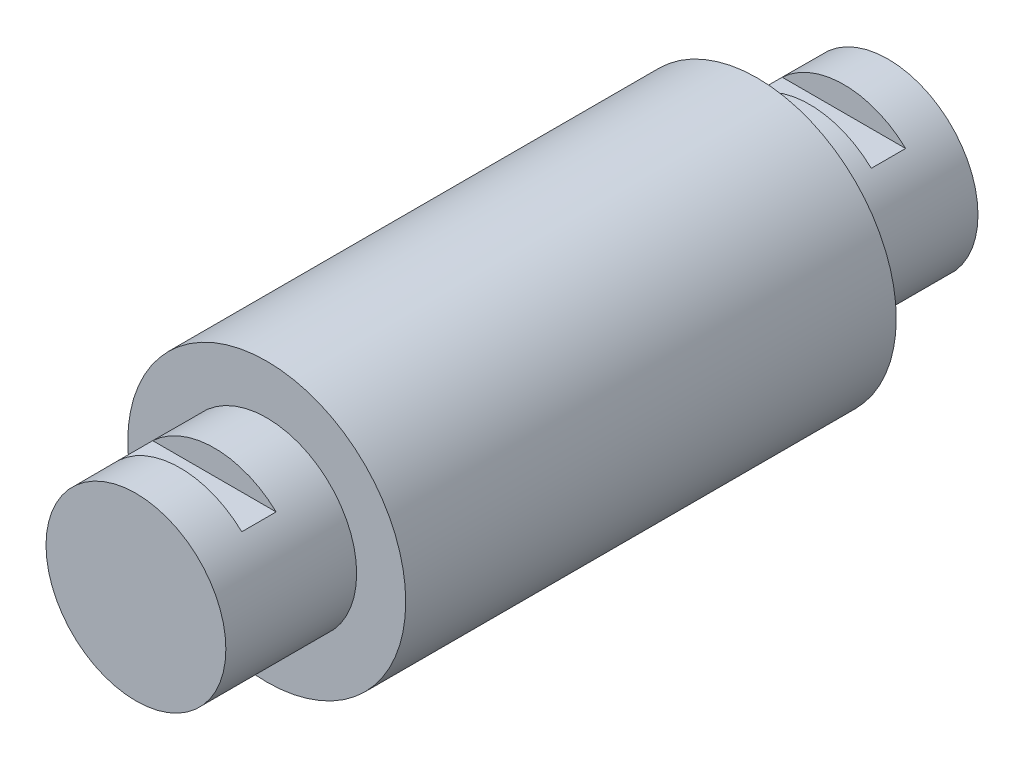
ISO-10303-21;
HEADER;
FILE_DESCRIPTION(('STEP AP214'),'2;1');
FILE_NAME('part.step','',(''),(''),'','','');
FILE_SCHEMA(('AUTOMOTIVE_DESIGN { 1 0 10303 214 1 1 1 1 }'));
ENDSEC;
DATA;
#1=APPLICATION_CONTEXT('core data for automotive mechanical design processes');
#2=APPLICATION_PROTOCOL_DEFINITION('international standard','automotive_design',2000,#1);
#3=PRODUCT_CONTEXT('',#1,'mechanical');
#4=PRODUCT('Part','Part','',(#3));
#5=PRODUCT_RELATED_PRODUCT_CATEGORY('part','',(#4));
#6=PRODUCT_DEFINITION_FORMATION('','',#4);
#7=PRODUCT_DEFINITION_CONTEXT('part definition',#1,'design');
#8=PRODUCT_DEFINITION('design','',#6,#7);
#9=PRODUCT_DEFINITION_SHAPE('','',#8);
#10=(LENGTH_UNIT() NAMED_UNIT(*) SI_UNIT(.MILLI.,.METRE.));
#11=(NAMED_UNIT(*) PLANE_ANGLE_UNIT() SI_UNIT($,.RADIAN.));
#12=(NAMED_UNIT(*) SI_UNIT($,.STERADIAN.) SOLID_ANGLE_UNIT());
#13=UNCERTAINTY_MEASURE_WITH_UNIT(LENGTH_MEASURE(1.E-05),#10,'distance_accuracy_value','');
#14=(GEOMETRIC_REPRESENTATION_CONTEXT(3) GLOBAL_UNCERTAINTY_ASSIGNED_CONTEXT((#13)) GLOBAL_UNIT_ASSIGNED_CONTEXT((#10,
#11,#12)) REPRESENTATION_CONTEXT('',''));
#15=CARTESIAN_POINT('',(0.,0.,0.));
#16=DIRECTION('',(0.,0.,1.));
#17=DIRECTION('',(1.,0.,0.));
#18=AXIS2_PLACEMENT_3D('',#15,#16,#17);
#19=CARTESIAN_POINT('',(0.,0.,-115.));
#20=DIRECTION('',(0.,0.,1.));
#21=DIRECTION('',(1.,0.,0.));
#22=AXIS2_PLACEMENT_3D('',#19,#20,#21);
#23=CYLINDRICAL_SURFACE('',#22,27.5);
#24=CARTESIAN_POINT('',(0.,0.,-115.));
#25=DIRECTION('',(0.,0.,1.));
#26=DIRECTION('',(1.,0.,0.));
#27=AXIS2_PLACEMENT_3D('',#24,#25,#26);
#28=CIRCLE('',#27,27.5);
#29=CARTESIAN_POINT('',(27.5,0.,-115.));
#30=VERTEX_POINT('',#29);
#31=EDGE_CURVE('E117',#30,#30,#28,.T.);
#32=ORIENTED_EDGE('',*,*,#31,.T.);
#33=EDGE_LOOP('',(#32));
#34=FACE_BOUND('',#33,.T.);
#35=CARTESIAN_POINT('',(0.,0.,-75.));
#36=DIRECTION('',(0.,0.,1.));
#37=DIRECTION('',(1.,0.,0.));
#38=AXIS2_PLACEMENT_3D('',#35,#36,#37);
#39=CIRCLE('',#38,27.5);
#40=CARTESIAN_POINT('',(27.5,0.,-75.));
#41=VERTEX_POINT('',#40);
#42=EDGE_CURVE('E120',#41,#41,#39,.T.);
#43=ORIENTED_EDGE('',*,*,#42,.F.);
#44=EDGE_LOOP('',(#43));
#45=FACE_BOUND('',#44,.T.);
#46=DIRECTION('',(0.,0.,1.));
#47=VECTOR('',#46,1.);
#48=CARTESIAN_POINT('',(-18.8745860881769,20.,-115.));
#49=LINE('',#48,#47);
#50=CARTESIAN_POINT('',(-18.8745860881769,20.,-91.));
#51=VERTEX_POINT('',#50);
#52=CARTESIAN_POINT('',(-18.8745860881769,20.,-101.5));
#53=VERTEX_POINT('',#52);
#54=EDGE_CURVE('E45',#51,#53,#49,.F.);
#55=ORIENTED_EDGE('',*,*,#54,.T.);
#56=CARTESIAN_POINT('',(0.,0.,-101.5));
#57=DIRECTION('',(0.,0.,1.));
#58=DIRECTION('',(1.,0.,0.));
#59=AXIS2_PLACEMENT_3D('',#56,#57,#58);
#60=CIRCLE('',#59,27.5);
#61=CARTESIAN_POINT('',(18.8745860881769,20.,-101.5));
#62=VERTEX_POINT('',#61);
#63=EDGE_CURVE('E11',#53,#62,#60,.F.);
#64=ORIENTED_EDGE('',*,*,#63,.T.);
#65=DIRECTION('',(0.,0.,1.));
#66=VECTOR('',#65,1.);
#67=CARTESIAN_POINT('',(18.8745860881769,20.,-115.));
#68=LINE('',#67,#66);
#69=CARTESIAN_POINT('',(18.8745860881769,20.,-91.));
#70=VERTEX_POINT('',#69);
#71=EDGE_CURVE('E81',#62,#70,#68,.T.);
#72=ORIENTED_EDGE('',*,*,#71,.T.);
#73=CARTESIAN_POINT('',(0.,0.,-91.));
#74=DIRECTION('',(0.,0.,-1.));
#75=DIRECTION('',(-1.,0.,0.));
#76=AXIS2_PLACEMENT_3D('',#73,#74,#75);
#77=CIRCLE('',#76,27.5);
#78=EDGE_CURVE('E76',#70,#51,#77,.F.);
#79=ORIENTED_EDGE('',*,*,#78,.T.);
#80=EDGE_LOOP('',(#55,#64,#72,#79));
#81=FACE_BOUND('',#80,.T.);
#82=ADVANCED_FACE('F37',(#34,#45,#81),#23,.T.);
#83=CARTESIAN_POINT('',(0.,0.,75.));
#84=DIRECTION('',(0.,0.,-1.));
#85=DIRECTION('',(-1.,0.,0.));
#86=AXIS2_PLACEMENT_3D('',#83,#84,#85);
#87=CYLINDRICAL_SURFACE('',#86,42.5);
#88=CARTESIAN_POINT('',(0.,0.,75.));
#89=DIRECTION('',(0.,0.,1.));
#90=DIRECTION('',(1.,0.,0.));
#91=AXIS2_PLACEMENT_3D('',#88,#89,#90);
#92=CIRCLE('',#91,42.5);
#93=CARTESIAN_POINT('',(42.5,0.,75.));
#94=VERTEX_POINT('',#93);
#95=EDGE_CURVE('E107',#94,#94,#92,.T.);
#96=ORIENTED_EDGE('',*,*,#95,.F.);
#97=EDGE_LOOP('',(#96));
#98=FACE_BOUND('',#97,.T.);
#99=CARTESIAN_POINT('',(0.,0.,-75.));
#100=DIRECTION('',(0.,0.,1.));
#101=DIRECTION('',(1.,0.,0.));
#102=AXIS2_PLACEMENT_3D('',#99,#100,#101);
#103=CIRCLE('',#102,42.5);
#104=CARTESIAN_POINT('',(42.5,0.,-75.));
#105=VERTEX_POINT('',#104);
#106=EDGE_CURVE('E104',#105,#105,#103,.T.);
#107=ORIENTED_EDGE('',*,*,#106,.T.);
#108=EDGE_LOOP('',(#107));
#109=FACE_BOUND('',#108,.T.);
#110=ADVANCED_FACE('F39',(#98,#109),#87,.T.);
#111=CARTESIAN_POINT('',(0.,0.,75.));
#112=DIRECTION('',(0.,0.,1.));
#113=DIRECTION('',(1.,0.,0.));
#114=AXIS2_PLACEMENT_3D('',#111,#112,#113);
#115=PLANE('',#114);
#116=CARTESIAN_POINT('',(0.,0.,75.));
#117=DIRECTION('',(0.,0.,1.));
#118=DIRECTION('',(1.,0.,0.));
#119=AXIS2_PLACEMENT_3D('',#116,#117,#118);
#120=CIRCLE('',#119,27.5);
#121=CARTESIAN_POINT('',(27.5,0.,75.));
#122=VERTEX_POINT('',#121);
#123=EDGE_CURVE('E103',#122,#122,#120,.T.);
#124=ORIENTED_EDGE('',*,*,#123,.F.);
#125=EDGE_LOOP('',(#124));
#126=FACE_BOUND('',#125,.T.);
#127=ORIENTED_EDGE('',*,*,#95,.T.);
#128=EDGE_LOOP('',(#127));
#129=FACE_BOUND('',#128,.T.);
#130=ADVANCED_FACE('F145',(#126,#129),#115,.T.);
#131=CARTESIAN_POINT('',(0.,0.,-75.));
#132=DIRECTION('',(0.,0.,1.));
#133=DIRECTION('',(1.,0.,0.));
#134=AXIS2_PLACEMENT_3D('',#131,#132,#133);
#135=PLANE('',#134);
#136=ORIENTED_EDGE('',*,*,#42,.T.);
#137=EDGE_LOOP('',(#136));
#138=FACE_BOUND('',#137,.T.);
#139=ORIENTED_EDGE('',*,*,#106,.F.);
#140=EDGE_LOOP('',(#139));
#141=FACE_BOUND('',#140,.T.);
#142=ADVANCED_FACE('F166',(#138,#141),#135,.F.);
#143=CARTESIAN_POINT('',(0.,0.,115.));
#144=DIRECTION('',(0.,0.,-1.));
#145=DIRECTION('',(-1.,0.,0.));
#146=AXIS2_PLACEMENT_3D('',#143,#144,#145);
#147=CYLINDRICAL_SURFACE('',#146,27.5);
#148=CARTESIAN_POINT('',(0.,0.,101.5));
#149=DIRECTION('',(0.,0.,1.));
#150=DIRECTION('',(1.,0.,0.));
#151=AXIS2_PLACEMENT_3D('',#148,#149,#150);
#152=CIRCLE('',#151,27.5);
#153=CARTESIAN_POINT('',(18.8745860881769,20.,101.5));
#154=VERTEX_POINT('',#153);
#155=CARTESIAN_POINT('',(-18.8745860881769,20.,101.5));
#156=VERTEX_POINT('',#155);
#157=EDGE_CURVE('E94',#154,#156,#152,.T.);
#158=ORIENTED_EDGE('',*,*,#157,.T.);
#159=DIRECTION('',(0.,0.,-1.));
#160=VECTOR('',#159,1.);
#161=CARTESIAN_POINT('',(-18.8745860881769,20.,115.));
#162=LINE('',#161,#160);
#163=CARTESIAN_POINT('',(-18.8745860881769,20.,91.));
#164=VERTEX_POINT('',#163);
#165=EDGE_CURVE('E82',#156,#164,#162,.T.);
#166=ORIENTED_EDGE('',*,*,#165,.T.);
#167=CARTESIAN_POINT('',(0.,0.,91.));
#168=DIRECTION('',(0.,0.,-1.));
#169=DIRECTION('',(-1.,0.,0.));
#170=AXIS2_PLACEMENT_3D('',#167,#168,#169);
#171=CIRCLE('',#170,27.5);
#172=CARTESIAN_POINT('',(18.8745860881769,20.,91.));
#173=VERTEX_POINT('',#172);
#174=EDGE_CURVE('E97',#164,#173,#171,.T.);
#175=ORIENTED_EDGE('',*,*,#174,.T.);
#176=DIRECTION('',(0.,0.,-1.));
#177=VECTOR('',#176,1.);
#178=CARTESIAN_POINT('',(18.8745860881769,20.,115.));
#179=LINE('',#178,#177);
#180=EDGE_CURVE('E100',#173,#154,#179,.F.);
#181=ORIENTED_EDGE('',*,*,#180,.T.);
#182=EDGE_LOOP('',(#158,#166,#175,#181));
#183=FACE_BOUND('',#182,.T.);
#184=CARTESIAN_POINT('',(0.,0.,115.));
#185=DIRECTION('',(0.,0.,1.));
#186=DIRECTION('',(1.,0.,0.));
#187=AXIS2_PLACEMENT_3D('',#184,#185,#186);
#188=CIRCLE('',#187,27.5);
#189=CARTESIAN_POINT('',(27.5,0.,115.));
#190=VERTEX_POINT('',#189);
#191=EDGE_CURVE('E108',#190,#190,#188,.T.);
#192=ORIENTED_EDGE('',*,*,#191,.F.);
#193=EDGE_LOOP('',(#192));
#194=FACE_BOUND('',#193,.T.);
#195=ORIENTED_EDGE('',*,*,#123,.T.);
#196=EDGE_LOOP('',(#195));
#197=FACE_BOUND('',#196,.T.);
#198=ADVANCED_FACE('F162',(#183,#194,#197),#147,.T.);
#199=CARTESIAN_POINT('',(0.,0.,115.));
#200=DIRECTION('',(0.,0.,1.));
#201=DIRECTION('',(1.,0.,0.));
#202=AXIS2_PLACEMENT_3D('',#199,#200,#201);
#203=PLANE('',#202);
#204=ORIENTED_EDGE('',*,*,#191,.T.);
#205=EDGE_LOOP('',(#204));
#206=FACE_BOUND('',#205,.T.);
#207=ADVANCED_FACE('F158',(#206),#203,.T.);
#208=CARTESIAN_POINT('',(-50.,28.7987965596709,101.5));
#209=DIRECTION('',(0.,0.,1.));
#210=DIRECTION('',(1.,0.,0.));
#211=AXIS2_PLACEMENT_3D('',#208,#209,#210);
#212=PLANE('',#211);
#213=DIRECTION('',(1.,0.,0.));
#214=VECTOR('',#213,1.);
#215=CARTESIAN_POINT('',(-50.,20.,101.5));
#216=LINE('',#215,#214);
#217=EDGE_CURVE('E59',#156,#154,#216,.T.);
#218=ORIENTED_EDGE('',*,*,#217,.F.);
#219=ORIENTED_EDGE('',*,*,#157,.F.);
#220=EDGE_LOOP('',(#218,#219));
#221=FACE_BOUND('',#220,.T.);
#222=ADVANCED_FACE('F152',(#221),#212,.F.);
#223=CARTESIAN_POINT('',(-50.,28.7987965596709,91.));
#224=DIRECTION('',(0.,0.,-1.));
#225=DIRECTION('',(-1.,0.,0.));
#226=AXIS2_PLACEMENT_3D('',#223,#224,#225);
#227=PLANE('',#226);
#228=DIRECTION('',(1.,0.,0.));
#229=VECTOR('',#228,1.);
#230=CARTESIAN_POINT('',(-50.,20.,91.));
#231=LINE('',#230,#229);
#232=EDGE_CURVE('E115',#164,#173,#231,.T.);
#233=ORIENTED_EDGE('',*,*,#232,.T.);
#234=ORIENTED_EDGE('',*,*,#174,.F.);
#235=EDGE_LOOP('',(#233,#234));
#236=FACE_BOUND('',#235,.T.);
#237=ADVANCED_FACE('F149',(#236),#227,.F.);
#238=CARTESIAN_POINT('',(-50.,20.,101.5));
#239=DIRECTION('',(0.,-1.,0.));
#240=DIRECTION('',(0.,0.,-1.));
#241=AXIS2_PLACEMENT_3D('',#238,#239,#240);
#242=PLANE('',#241);
#243=ORIENTED_EDGE('',*,*,#217,.T.);
#244=ORIENTED_EDGE('',*,*,#180,.F.);
#245=ORIENTED_EDGE('',*,*,#232,.F.);
#246=ORIENTED_EDGE('',*,*,#165,.F.);
#247=EDGE_LOOP('',(#243,#244,#245,#246));
#248=FACE_BOUND('',#247,.T.);
#249=ADVANCED_FACE('F135',(#248),#242,.F.);
#250=CARTESIAN_POINT('',(0.,0.,-115.));
#251=DIRECTION('',(0.,0.,-1.));
#252=DIRECTION('',(1.,0.,0.));
#253=AXIS2_PLACEMENT_3D('',#250,#251,#252);
#254=PLANE('',#253);
#255=ORIENTED_EDGE('',*,*,#31,.F.);
#256=EDGE_LOOP('',(#255));
#257=FACE_BOUND('',#256,.T.);
#258=ADVANCED_FACE('F128',(#257),#254,.T.);
#259=CARTESIAN_POINT('',(-50.,28.7987965596709,-101.5));
#260=DIRECTION('',(0.,0.,1.));
#261=DIRECTION('',(1.,0.,0.));
#262=AXIS2_PLACEMENT_3D('',#259,#260,#261);
#263=PLANE('',#262);
#264=DIRECTION('',(1.,0.,0.));
#265=VECTOR('',#264,1.);
#266=CARTESIAN_POINT('',(-50.,20.,-101.5));
#267=LINE('',#266,#265);
#268=EDGE_CURVE('E88',#53,#62,#267,.T.);
#269=ORIENTED_EDGE('',*,*,#268,.T.);
#270=ORIENTED_EDGE('',*,*,#63,.F.);
#271=EDGE_LOOP('',(#269,#270));
#272=FACE_BOUND('',#271,.T.);
#273=ADVANCED_FACE('F126',(#272),#263,.T.);
#274=CARTESIAN_POINT('',(-50.,20.,-101.5));
#275=DIRECTION('',(0.,1.,0.));
#276=DIRECTION('',(0.,0.,1.));
#277=AXIS2_PLACEMENT_3D('',#274,#275,#276);
#278=PLANE('',#277);
#279=DIRECTION('',(1.,0.,0.));
#280=VECTOR('',#279,1.);
#281=CARTESIAN_POINT('',(-50.,20.,-91.));
#282=LINE('',#281,#280);
#283=EDGE_CURVE('E51',#51,#70,#282,.T.);
#284=ORIENTED_EDGE('',*,*,#283,.T.);
#285=ORIENTED_EDGE('',*,*,#71,.F.);
#286=ORIENTED_EDGE('',*,*,#268,.F.);
#287=ORIENTED_EDGE('',*,*,#54,.F.);
#288=EDGE_LOOP('',(#284,#285,#286,#287));
#289=FACE_BOUND('',#288,.T.);
#290=ADVANCED_FACE('F85',(#289),#278,.T.);
#291=CARTESIAN_POINT('',(-50.,28.7987965596709,-91.));
#292=DIRECTION('',(0.,0.,-1.));
#293=DIRECTION('',(-1.,0.,0.));
#294=AXIS2_PLACEMENT_3D('',#291,#292,#293);
#295=PLANE('',#294);
#296=ORIENTED_EDGE('',*,*,#283,.F.);
#297=ORIENTED_EDGE('',*,*,#78,.F.);
#298=EDGE_LOOP('',(#296,#297));
#299=FACE_BOUND('',#298,.T.);
#300=ADVANCED_FACE('F77',(#299),#295,.T.);
#301=CLOSED_SHELL('',(#82,#110,#130,#142,#198,#207,#222,#237,#249,#258,#273,#290,#300));
#302=MANIFOLD_SOLID_BREP('B2',#301);
#303=ADVANCED_BREP_SHAPE_REPRESENTATION('',(#18,#302),#14);
#304=SHAPE_DEFINITION_REPRESENTATION(#9,#303);
ENDSEC;
END-ISO-10303-21;
